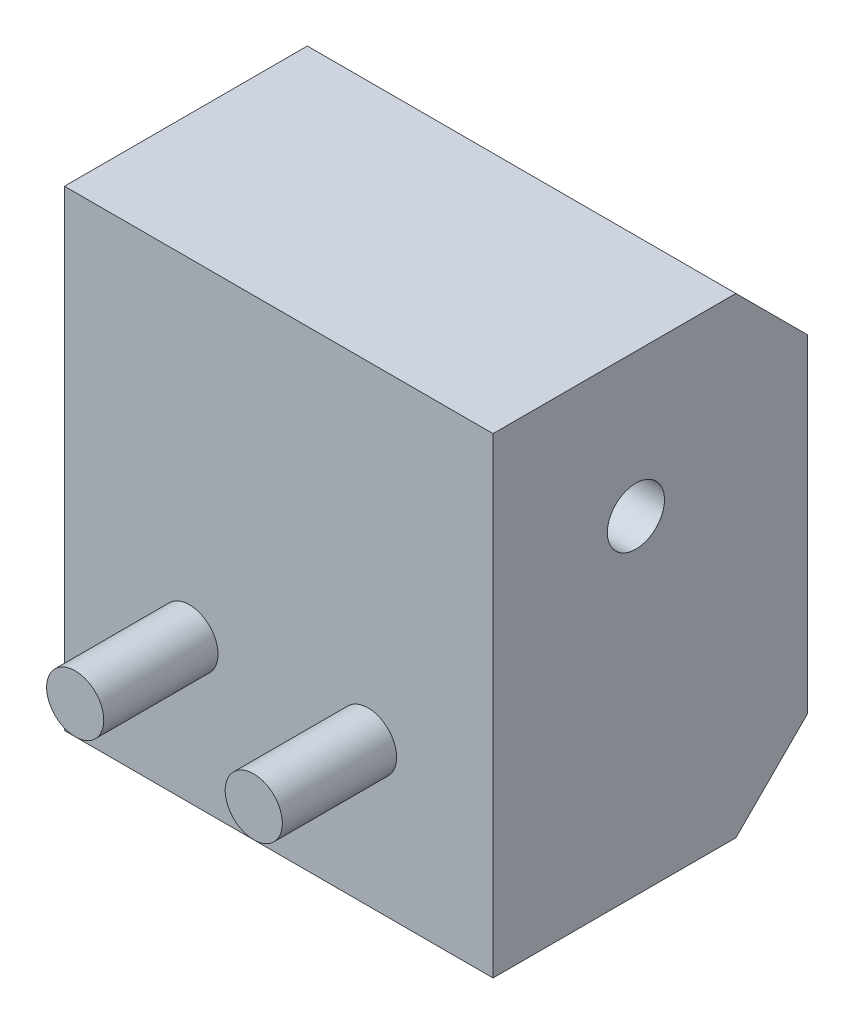
ISO-10303-21;
HEADER;
FILE_DESCRIPTION(('STEP AP214'),'2;1');
FILE_NAME('part.step','',(''),(''),'','','');
FILE_SCHEMA(('AUTOMOTIVE_DESIGN { 1 0 10303 214 1 1 1 1 }'));
ENDSEC;
DATA;
#1=APPLICATION_CONTEXT('core data for automotive mechanical design processes');
#2=APPLICATION_PROTOCOL_DEFINITION('international standard','automotive_design',2000,#1);
#3=PRODUCT_CONTEXT('',#1,'mechanical');
#4=PRODUCT('Part','Part','',(#3));
#5=PRODUCT_RELATED_PRODUCT_CATEGORY('part','',(#4));
#6=PRODUCT_DEFINITION_FORMATION('','',#4);
#7=PRODUCT_DEFINITION_CONTEXT('part definition',#1,'design');
#8=PRODUCT_DEFINITION('design','',#6,#7);
#9=PRODUCT_DEFINITION_SHAPE('','',#8);
#10=(LENGTH_UNIT() NAMED_UNIT(*) SI_UNIT(.MILLI.,.METRE.));
#11=(NAMED_UNIT(*) PLANE_ANGLE_UNIT() SI_UNIT($,.RADIAN.));
#12=(NAMED_UNIT(*) SI_UNIT($,.STERADIAN.) SOLID_ANGLE_UNIT());
#13=UNCERTAINTY_MEASURE_WITH_UNIT(LENGTH_MEASURE(1.E-05),#10,'distance_accuracy_value','');
#14=(GEOMETRIC_REPRESENTATION_CONTEXT(3) GLOBAL_UNCERTAINTY_ASSIGNED_CONTEXT((#13)) GLOBAL_UNIT_ASSIGNED_CONTEXT((#10,
#11,#12)) REPRESENTATION_CONTEXT('',''));
#15=CARTESIAN_POINT('',(0.,0.,0.));
#16=DIRECTION('',(0.,0.,1.));
#17=DIRECTION('',(1.,0.,0.));
#18=AXIS2_PLACEMENT_3D('',#15,#16,#17);
#19=CARTESIAN_POINT('',(-15.1660516605166,12.0664206642066,22.));
#20=DIRECTION('',(1.,0.,0.));
#21=DIRECTION('',(0.,1.,0.));
#22=AXIS2_PLACEMENT_3D('',#19,#20,#21);
#23=PLANE('',#22);
#24=CARTESIAN_POINT('',(-15.1660516605166,2.06642066420664,12.));
#25=DIRECTION('',(1.,0.,0.));
#26=DIRECTION('',(0.,1.,0.));
#27=AXIS2_PLACEMENT_3D('',#24,#25,#26);
#28=CIRCLE('',#27,2.);
#29=CARTESIAN_POINT('',(-15.1660516605166,4.06642066420664,12.));
#30=VERTEX_POINT('',#29);
#31=EDGE_CURVE('E206',#30,#30,#28,.T.);
#32=ORIENTED_EDGE('',*,*,#31,.T.);
#33=EDGE_LOOP('',(#32));
#34=FACE_BOUND('',#33,.T.);
#35=DIRECTION('',(0.,-1.,0.));
#36=VECTOR('',#35,1.);
#37=CARTESIAN_POINT('',(-15.1660516605166,12.0664206642066,0.));
#38=LINE('',#37,#36);
#39=CARTESIAN_POINT('',(-15.1660516605166,7.06642066420663,0.));
#40=VERTEX_POINT('',#39);
#41=CARTESIAN_POINT('',(-15.1660516605166,-15.9335793357933,0.));
#42=VERTEX_POINT('',#41);
#43=EDGE_CURVE('E136',#40,#42,#38,.T.);
#44=ORIENTED_EDGE('',*,*,#43,.T.);
#45=DIRECTION('',(0.,0.707106781186549,-0.707106781186547));
#46=VECTOR('',#45,1.);
#47=CARTESIAN_POINT('',(-15.1660516605166,-20.9335793357934,5.));
#48=LINE('',#47,#46);
#49=CARTESIAN_POINT('',(-15.1660516605166,-20.9335793357934,5.));
#50=VERTEX_POINT('',#49);
#51=EDGE_CURVE('E11',#42,#50,#48,.F.);
#52=ORIENTED_EDGE('',*,*,#51,.T.);
#53=DIRECTION('',(0.,0.,-1.));
#54=VECTOR('',#53,1.);
#55=CARTESIAN_POINT('',(-15.1660516605166,-20.9335793357934,22.));
#56=LINE('',#55,#54);
#57=CARTESIAN_POINT('',(-15.1660516605166,-20.9335793357934,22.));
#58=VERTEX_POINT('',#57);
#59=EDGE_CURVE('E93',#58,#50,#56,.T.);
#60=ORIENTED_EDGE('',*,*,#59,.F.);
#61=DIRECTION('',(0.,-1.,0.));
#62=VECTOR('',#61,1.);
#63=CARTESIAN_POINT('',(-15.1660516605166,12.0664206642066,22.));
#64=LINE('',#63,#62);
#65=CARTESIAN_POINT('',(-15.1660516605166,12.0664206642066,22.));
#66=VERTEX_POINT('',#65);
#67=EDGE_CURVE('E99',#66,#58,#64,.T.);
#68=ORIENTED_EDGE('',*,*,#67,.F.);
#69=DIRECTION('',(0.,0.,-1.));
#70=VECTOR('',#69,1.);
#71=CARTESIAN_POINT('',(-15.1660516605166,12.0664206642066,22.));
#72=LINE('',#71,#70);
#73=CARTESIAN_POINT('',(-15.1660516605166,12.0664206642066,5.));
#74=VERTEX_POINT('',#73);
#75=EDGE_CURVE('E133',#66,#74,#72,.T.);
#76=ORIENTED_EDGE('',*,*,#75,.T.);
#77=DIRECTION('',(0.,0.707106781186549,0.707106781186547));
#78=VECTOR('',#77,1.);
#79=CARTESIAN_POINT('',(-15.1660516605166,12.0664206642066,5.));
#80=LINE('',#79,#78);
#81=EDGE_CURVE('E114',#74,#40,#80,.F.);
#82=ORIENTED_EDGE('',*,*,#81,.T.);
#83=EDGE_LOOP('',(#44,#52,#60,#68,#76,#82));
#84=FACE_BOUND('',#83,.T.);
#85=ADVANCED_FACE('F35',(#34,#84),#23,.F.);
#86=CARTESIAN_POINT('',(-15.1660516605166,-20.9335793357934,22.));
#87=DIRECTION('',(0.,1.,0.));
#88=DIRECTION('',(0.,0.,1.));
#89=AXIS2_PLACEMENT_3D('',#86,#87,#88);
#90=PLANE('',#89);
#91=ORIENTED_EDGE('',*,*,#59,.T.);
#92=DIRECTION('',(1.,0.,0.));
#93=VECTOR('',#92,1.);
#94=CARTESIAN_POINT('',(-15.1660516605166,-20.9335793357934,5.));
#95=LINE('',#94,#93);
#96=CARTESIAN_POINT('',(14.8339483394834,-20.9335793357934,5.));
#97=VERTEX_POINT('',#96);
#98=EDGE_CURVE('E126',#50,#97,#95,.T.);
#99=ORIENTED_EDGE('',*,*,#98,.T.);
#100=DIRECTION('',(0.,0.,-1.));
#101=VECTOR('',#100,1.);
#102=CARTESIAN_POINT('',(14.8339483394834,-20.9335793357934,22.));
#103=LINE('',#102,#101);
#104=CARTESIAN_POINT('',(14.8339483394834,-20.9335793357934,22.));
#105=VERTEX_POINT('',#104);
#106=EDGE_CURVE('E95',#105,#97,#103,.T.);
#107=ORIENTED_EDGE('',*,*,#106,.F.);
#108=DIRECTION('',(1.,0.,0.));
#109=VECTOR('',#108,1.);
#110=CARTESIAN_POINT('',(-15.1660516605166,-20.9335793357934,22.));
#111=LINE('',#110,#109);
#112=EDGE_CURVE('E88',#58,#105,#111,.T.);
#113=ORIENTED_EDGE('',*,*,#112,.F.);
#114=EDGE_LOOP('',(#91,#99,#107,#113));
#115=FACE_BOUND('',#114,.T.);
#116=ADVANCED_FACE('F90',(#115),#90,.F.);
#117=CARTESIAN_POINT('',(14.8339483394834,12.0664206642066,22.));
#118=DIRECTION('',(-1.,0.,0.));
#119=DIRECTION('',(0.,-1.,0.));
#120=AXIS2_PLACEMENT_3D('',#117,#118,#119);
#121=PLANE('',#120);
#122=CARTESIAN_POINT('',(14.8339483394834,2.06642066420665,12.));
#123=DIRECTION('',(1.,0.,0.));
#124=DIRECTION('',(0.,1.,0.));
#125=AXIS2_PLACEMENT_3D('',#122,#123,#124);
#126=CIRCLE('',#125,2.);
#127=CARTESIAN_POINT('',(14.8339483394834,4.06642066420665,12.));
#128=VERTEX_POINT('',#127);
#129=EDGE_CURVE('E216',#128,#128,#126,.T.);
#130=ORIENTED_EDGE('',*,*,#129,.F.);
#131=EDGE_LOOP('',(#130));
#132=FACE_BOUND('',#131,.T.);
#133=ORIENTED_EDGE('',*,*,#106,.T.);
#134=DIRECTION('',(0.,-0.707106781186549,0.707106781186547));
#135=VECTOR('',#134,1.);
#136=CARTESIAN_POINT('',(14.8339483394834,-20.9335793357934,5.));
#137=LINE('',#136,#135);
#138=CARTESIAN_POINT('',(14.8339483394834,-15.9335793357933,0.));
#139=VERTEX_POINT('',#138);
#140=EDGE_CURVE('E58',#97,#139,#137,.F.);
#141=ORIENTED_EDGE('',*,*,#140,.T.);
#142=DIRECTION('',(0.,1.,0.));
#143=VECTOR('',#142,1.);
#144=CARTESIAN_POINT('',(14.8339483394834,12.0664206642066,0.));
#145=LINE('',#144,#143);
#146=CARTESIAN_POINT('',(14.8339483394834,7.06642066420663,0.));
#147=VERTEX_POINT('',#146);
#148=EDGE_CURVE('E108',#139,#147,#145,.T.);
#149=ORIENTED_EDGE('',*,*,#148,.T.);
#150=DIRECTION('',(0.,-0.707106781186549,-0.707106781186547));
#151=VECTOR('',#150,1.);
#152=CARTESIAN_POINT('',(14.8339483394834,12.0664206642066,5.00000000000001));
#153=LINE('',#152,#151);
#154=CARTESIAN_POINT('',(14.8339483394834,12.0664206642066,5.));
#155=VERTEX_POINT('',#154);
#156=EDGE_CURVE('E124',#147,#155,#153,.F.);
#157=ORIENTED_EDGE('',*,*,#156,.T.);
#158=DIRECTION('',(0.,0.,-1.));
#159=VECTOR('',#158,1.);
#160=CARTESIAN_POINT('',(14.8339483394834,12.0664206642066,22.));
#161=LINE('',#160,#159);
#162=CARTESIAN_POINT('',(14.8339483394834,12.0664206642066,22.));
#163=VERTEX_POINT('',#162);
#164=EDGE_CURVE('E116',#163,#155,#161,.T.);
#165=ORIENTED_EDGE('',*,*,#164,.F.);
#166=DIRECTION('',(0.,1.,0.));
#167=VECTOR('',#166,1.);
#168=CARTESIAN_POINT('',(14.8339483394834,12.0664206642066,22.));
#169=LINE('',#168,#167);
#170=EDGE_CURVE('E98',#105,#163,#169,.T.);
#171=ORIENTED_EDGE('',*,*,#170,.F.);
#172=EDGE_LOOP('',(#133,#141,#149,#157,#165,#171));
#173=FACE_BOUND('',#172,.T.);
#174=ADVANCED_FACE('F129',(#132,#173),#121,.F.);
#175=CARTESIAN_POINT('',(-15.1660516605166,12.0664206642066,22.));
#176=DIRECTION('',(0.,-1.,0.));
#177=DIRECTION('',(0.,0.,-1.));
#178=AXIS2_PLACEMENT_3D('',#175,#176,#177);
#179=PLANE('',#178);
#180=ORIENTED_EDGE('',*,*,#164,.T.);
#181=DIRECTION('',(-1.,0.,0.));
#182=VECTOR('',#181,1.);
#183=CARTESIAN_POINT('',(-15.1660516605166,12.0664206642066,5.));
#184=LINE('',#183,#182);
#185=EDGE_CURVE('E111',#155,#74,#184,.T.);
#186=ORIENTED_EDGE('',*,*,#185,.T.);
#187=ORIENTED_EDGE('',*,*,#75,.F.);
#188=DIRECTION('',(-1.,0.,0.));
#189=VECTOR('',#188,1.);
#190=CARTESIAN_POINT('',(-15.1660516605166,12.0664206642066,22.));
#191=LINE('',#190,#189);
#192=EDGE_CURVE('E104',#163,#66,#191,.T.);
#193=ORIENTED_EDGE('',*,*,#192,.F.);
#194=EDGE_LOOP('',(#180,#186,#187,#193));
#195=FACE_BOUND('',#194,.T.);
#196=ADVANCED_FACE('F142',(#195),#179,.F.);
#197=CARTESIAN_POINT('',(0.,0.,22.));
#198=DIRECTION('',(0.,0.,1.));
#199=DIRECTION('',(1.,0.,0.));
#200=AXIS2_PLACEMENT_3D('',#197,#198,#199);
#201=PLANE('',#200);
#202=CARTESIAN_POINT('',(6.0839483394834,-10.9335793357934,22.));
#203=DIRECTION('',(0.,0.,1.));
#204=DIRECTION('',(1.,0.,0.));
#205=AXIS2_PLACEMENT_3D('',#202,#203,#204);
#206=CIRCLE('',#205,2.);
#207=CARTESIAN_POINT('',(8.0839483394834,-10.9335793357934,22.));
#208=VERTEX_POINT('',#207);
#209=EDGE_CURVE('E201',#208,#208,#206,.T.);
#210=ORIENTED_EDGE('',*,*,#209,.F.);
#211=EDGE_LOOP('',(#210));
#212=FACE_BOUND('',#211,.T.);
#213=CARTESIAN_POINT('',(-6.4160516605166,-10.9335793357934,22.));
#214=DIRECTION('',(0.,0.,1.));
#215=DIRECTION('',(1.,0.,0.));
#216=AXIS2_PLACEMENT_3D('',#213,#214,#215);
#217=CIRCLE('',#216,2.);
#218=CARTESIAN_POINT('',(-4.4160516605166,-10.9335793357934,22.));
#219=VERTEX_POINT('',#218);
#220=EDGE_CURVE('E200',#219,#219,#217,.T.);
#221=ORIENTED_EDGE('',*,*,#220,.F.);
#222=EDGE_LOOP('',(#221));
#223=FACE_BOUND('',#222,.T.);
#224=ORIENTED_EDGE('',*,*,#67,.T.);
#225=ORIENTED_EDGE('',*,*,#112,.T.);
#226=ORIENTED_EDGE('',*,*,#170,.T.);
#227=ORIENTED_EDGE('',*,*,#192,.T.);
#228=EDGE_LOOP('',(#224,#225,#226,#227));
#229=FACE_BOUND('',#228,.T.);
#230=ADVANCED_FACE('F102',(#212,#223,#229),#201,.T.);
#231=CARTESIAN_POINT('',(0.,0.,0.));
#232=DIRECTION('',(0.,0.,1.));
#233=DIRECTION('',(1.,0.,0.));
#234=AXIS2_PLACEMENT_3D('',#231,#232,#233);
#235=PLANE('',#234);
#236=ORIENTED_EDGE('',*,*,#148,.F.);
#237=DIRECTION('',(-1.,0.,0.));
#238=VECTOR('',#237,1.);
#239=CARTESIAN_POINT('',(0.,-15.9335793357933,0.));
#240=LINE('',#239,#238);
#241=EDGE_CURVE('E44',#139,#42,#240,.T.);
#242=ORIENTED_EDGE('',*,*,#241,.T.);
#243=ORIENTED_EDGE('',*,*,#43,.F.);
#244=DIRECTION('',(1.,0.,0.));
#245=VECTOR('',#244,1.);
#246=CARTESIAN_POINT('',(0.,7.06642066420663,0.));
#247=LINE('',#246,#245);
#248=EDGE_CURVE('E121',#40,#147,#247,.T.);
#249=ORIENTED_EDGE('',*,*,#248,.T.);
#250=EDGE_LOOP('',(#236,#242,#243,#249));
#251=FACE_BOUND('',#250,.T.);
#252=ADVANCED_FACE('F147',(#251),#235,.F.);
#253=CARTESIAN_POINT('',(-6.4160516605166,-10.9335793357934,30.));
#254=DIRECTION('',(0.,0.,-1.));
#255=DIRECTION('',(-1.,0.,0.));
#256=AXIS2_PLACEMENT_3D('',#253,#254,#255);
#257=CYLINDRICAL_SURFACE('',#256,2.);
#258=CARTESIAN_POINT('',(-6.4160516605166,-10.9335793357934,30.));
#259=DIRECTION('',(0.,0.,1.));
#260=DIRECTION('',(1.,0.,0.));
#261=AXIS2_PLACEMENT_3D('',#258,#259,#260);
#262=CIRCLE('',#261,2.);
#263=CARTESIAN_POINT('',(-4.4160516605166,-10.9335793357934,30.));
#264=VERTEX_POINT('',#263);
#265=EDGE_CURVE('E138',#264,#264,#262,.T.);
#266=ORIENTED_EDGE('',*,*,#265,.F.);
#267=EDGE_LOOP('',(#266));
#268=FACE_BOUND('',#267,.T.);
#269=ORIENTED_EDGE('',*,*,#220,.T.);
#270=EDGE_LOOP('',(#269));
#271=FACE_BOUND('',#270,.T.);
#272=ADVANCED_FACE('F178',(#268,#271),#257,.T.);
#273=CARTESIAN_POINT('',(-6.4160516605166,-10.9335793357934,30.));
#274=DIRECTION('',(0.,0.,1.));
#275=DIRECTION('',(1.,0.,0.));
#276=AXIS2_PLACEMENT_3D('',#273,#274,#275);
#277=PLANE('',#276);
#278=ORIENTED_EDGE('',*,*,#265,.T.);
#279=EDGE_LOOP('',(#278));
#280=FACE_BOUND('',#279,.T.);
#281=ADVANCED_FACE('F184',(#280),#277,.T.);
#282=CARTESIAN_POINT('',(6.0839483394834,-10.9335793357934,30.));
#283=DIRECTION('',(0.,0.,-1.));
#284=DIRECTION('',(-1.,0.,0.));
#285=AXIS2_PLACEMENT_3D('',#282,#283,#284);
#286=CYLINDRICAL_SURFACE('',#285,2.);
#287=CARTESIAN_POINT('',(6.0839483394834,-10.9335793357934,30.));
#288=DIRECTION('',(0.,0.,1.));
#289=DIRECTION('',(1.,0.,0.));
#290=AXIS2_PLACEMENT_3D('',#287,#288,#289);
#291=CIRCLE('',#290,2.);
#292=CARTESIAN_POINT('',(8.0839483394834,-10.9335793357934,30.));
#293=VERTEX_POINT('',#292);
#294=EDGE_CURVE('E199',#293,#293,#291,.T.);
#295=ORIENTED_EDGE('',*,*,#294,.F.);
#296=EDGE_LOOP('',(#295));
#297=FACE_BOUND('',#296,.T.);
#298=ORIENTED_EDGE('',*,*,#209,.T.);
#299=EDGE_LOOP('',(#298));
#300=FACE_BOUND('',#299,.T.);
#301=ADVANCED_FACE('F188',(#297,#300),#286,.T.);
#302=CARTESIAN_POINT('',(6.0839483394834,-10.9335793357934,30.));
#303=DIRECTION('',(0.,0.,1.));
#304=DIRECTION('',(1.,0.,0.));
#305=AXIS2_PLACEMENT_3D('',#302,#303,#304);
#306=PLANE('',#305);
#307=ORIENTED_EDGE('',*,*,#294,.T.);
#308=EDGE_LOOP('',(#307));
#309=FACE_BOUND('',#308,.T.);
#310=ADVANCED_FACE('F156',(#309),#306,.T.);
#311=CARTESIAN_POINT('',(-15.1660516605166,12.0664206642066,5.));
#312=DIRECTION('',(0.,-0.707106781186547,0.707106781186549));
#313=DIRECTION('',(-1.,0.,0.));
#314=AXIS2_PLACEMENT_3D('',#311,#312,#313);
#315=PLANE('',#314);
#316=ORIENTED_EDGE('',*,*,#156,.F.);
#317=ORIENTED_EDGE('',*,*,#248,.F.);
#318=ORIENTED_EDGE('',*,*,#81,.F.);
#319=ORIENTED_EDGE('',*,*,#185,.F.);
#320=EDGE_LOOP('',(#316,#317,#318,#319));
#321=FACE_BOUND('',#320,.T.);
#322=ADVANCED_FACE('F145',(#321),#315,.F.);
#323=CARTESIAN_POINT('',(-15.1660516605166,-20.9335793357934,5.));
#324=DIRECTION('',(0.,0.707106781186547,0.707106781186549));
#325=DIRECTION('',(1.,0.,0.));
#326=AXIS2_PLACEMENT_3D('',#323,#324,#325);
#327=PLANE('',#326);
#328=ORIENTED_EDGE('',*,*,#51,.F.);
#329=ORIENTED_EDGE('',*,*,#241,.F.);
#330=ORIENTED_EDGE('',*,*,#140,.F.);
#331=ORIENTED_EDGE('',*,*,#98,.F.);
#332=EDGE_LOOP('',(#328,#329,#330,#331));
#333=FACE_BOUND('',#332,.T.);
#334=ADVANCED_FACE('F38',(#333),#327,.F.);
#335=CARTESIAN_POINT('',(-20.1660516605166,2.06642066420664,12.));
#336=DIRECTION('',(1.,0.,0.));
#337=DIRECTION('',(0.,1.,0.));
#338=AXIS2_PLACEMENT_3D('',#335,#336,#337);
#339=CYLINDRICAL_SURFACE('',#338,2.);
#340=ORIENTED_EDGE('',*,*,#129,.T.);
#341=EDGE_LOOP('',(#340));
#342=FACE_BOUND('',#341,.T.);
#343=ORIENTED_EDGE('',*,*,#31,.F.);
#344=EDGE_LOOP('',(#343));
#345=FACE_BOUND('',#344,.T.);
#346=ADVANCED_FACE('F149',(#342,#345),#339,.F.);
#347=CLOSED_SHELL('',(#85,#116,#174,#196,#230,#252,#272,#281,#301,#310,#322,#334,#346));
#348=MANIFOLD_SOLID_BREP('B2',#347);
#349=ADVANCED_BREP_SHAPE_REPRESENTATION('',(#18,#348),#14);
#350=SHAPE_DEFINITION_REPRESENTATION(#9,#349);
ENDSEC;
END-ISO-10303-21;
